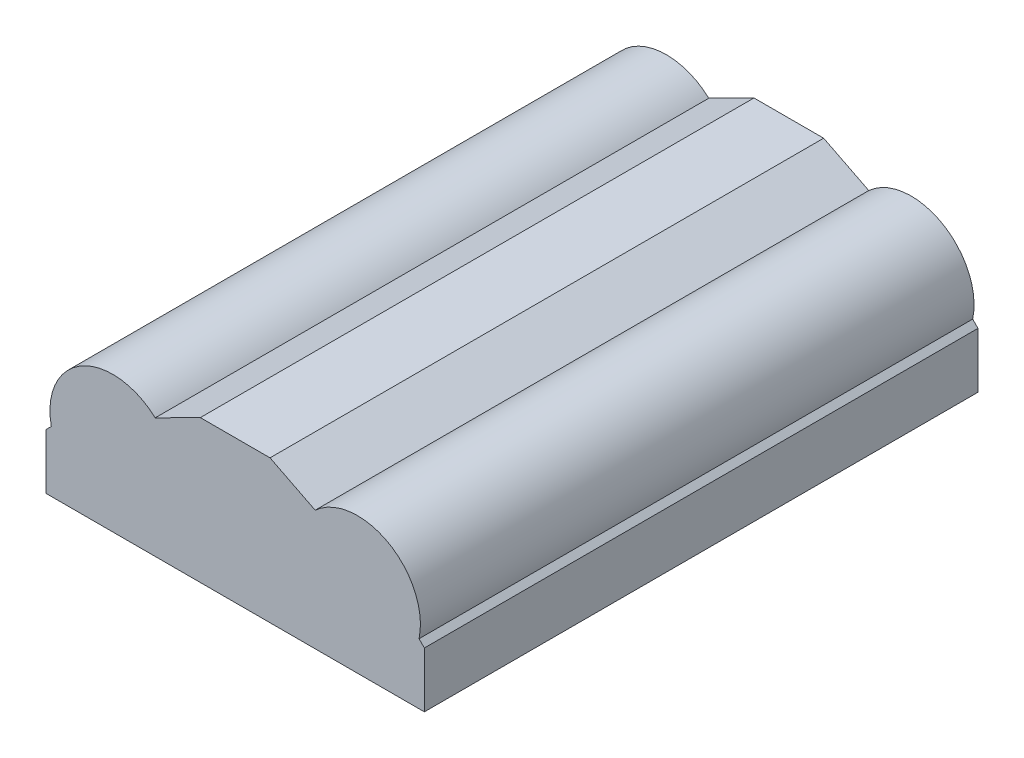
ISO-10303-21;
HEADER;
FILE_DESCRIPTION(('STEP AP214'),'2;1');
FILE_NAME('part.step','',(''),(''),'','','');
FILE_SCHEMA(('AUTOMOTIVE_DESIGN { 1 0 10303 214 1 1 1 1 }'));
ENDSEC;
DATA;
#1=APPLICATION_CONTEXT('core data for automotive mechanical design processes');
#2=APPLICATION_PROTOCOL_DEFINITION('international standard','automotive_design',2000,#1);
#3=PRODUCT_CONTEXT('',#1,'mechanical');
#4=PRODUCT('Part','Part','',(#3));
#5=PRODUCT_RELATED_PRODUCT_CATEGORY('part','',(#4));
#6=PRODUCT_DEFINITION_FORMATION('','',#4);
#7=PRODUCT_DEFINITION_CONTEXT('part definition',#1,'design');
#8=PRODUCT_DEFINITION('design','',#6,#7);
#9=PRODUCT_DEFINITION_SHAPE('','',#8);
#10=(LENGTH_UNIT() NAMED_UNIT(*) SI_UNIT(.MILLI.,.METRE.));
#11=(NAMED_UNIT(*) PLANE_ANGLE_UNIT() SI_UNIT($,.RADIAN.));
#12=(NAMED_UNIT(*) SI_UNIT($,.STERADIAN.) SOLID_ANGLE_UNIT());
#13=UNCERTAINTY_MEASURE_WITH_UNIT(LENGTH_MEASURE(1.E-05),#10,'distance_accuracy_value','');
#14=(GEOMETRIC_REPRESENTATION_CONTEXT(3) GLOBAL_UNCERTAINTY_ASSIGNED_CONTEXT((#13)) GLOBAL_UNIT_ASSIGNED_CONTEXT((#10,
#11,#12)) REPRESENTATION_CONTEXT('',''));
#15=CARTESIAN_POINT('',(0.,0.,0.));
#16=DIRECTION('',(0.,0.,1.));
#17=DIRECTION('',(1.,0.,0.));
#18=AXIS2_PLACEMENT_3D('',#15,#16,#17);
#19=CARTESIAN_POINT('',(0.,105.,0.));
#20=DIRECTION('',(1.,0.,0.));
#21=DIRECTION('',(0.,0.,-1.));
#22=AXIS2_PLACEMENT_3D('',#19,#20,#21);
#23=PLANE('',#22);
#24=DIRECTION('',(0.,0.,1.));
#25=VECTOR('',#24,1.);
#26=CARTESIAN_POINT('',(0.,27.7914883982121,-278.));
#27=LINE('',#26,#25);
#28=CARTESIAN_POINT('',(0.,27.7914883982121,-278.));
#29=VERTEX_POINT('',#28);
#30=CARTESIAN_POINT('',(0.,27.7914883982121,0.));
#31=VERTEX_POINT('',#30);
#32=EDGE_CURVE('E171',#29,#31,#27,.T.);
#33=ORIENTED_EDGE('',*,*,#32,.F.);
#34=DIRECTION('',(0.,-1.,0.));
#35=VECTOR('',#34,1.);
#36=CARTESIAN_POINT('',(0.,105.,-278.));
#37=LINE('',#36,#35);
#38=CARTESIAN_POINT('',(0.,0.,-278.));
#39=VERTEX_POINT('',#38);
#40=EDGE_CURVE('E60',#29,#39,#37,.T.);
#41=ORIENTED_EDGE('',*,*,#40,.T.);
#42=DIRECTION('',(0.,0.,1.));
#43=VECTOR('',#42,1.);
#44=CARTESIAN_POINT('',(0.,0.,0.));
#45=LINE('',#44,#43);
#46=CARTESIAN_POINT('',(0.,0.,0.));
#47=VERTEX_POINT('',#46);
#48=EDGE_CURVE('E173',#39,#47,#45,.T.);
#49=ORIENTED_EDGE('',*,*,#48,.T.);
#50=DIRECTION('',(0.,-1.,0.));
#51=VECTOR('',#50,1.);
#52=CARTESIAN_POINT('',(0.,105.,0.));
#53=LINE('',#52,#51);
#54=EDGE_CURVE('E12',#31,#47,#53,.T.);
#55=ORIENTED_EDGE('',*,*,#54,.F.);
#56=EDGE_LOOP('',(#33,#41,#49,#55));
#57=FACE_BOUND('',#56,.T.);
#58=ADVANCED_FACE('F38',(#57),#23,.F.);
#59=CARTESIAN_POINT('',(0.,105.,0.));
#60=DIRECTION('',(0.,0.,-1.));
#61=DIRECTION('',(-1.,0.,0.));
#62=AXIS2_PLACEMENT_3D('',#59,#60,#61);
#63=PLANE('',#62);
#64=DIRECTION('',(-0.707106781186542,-0.707106781186553,0.));
#65=VECTOR('',#64,1.);
#66=CARTESIAN_POINT('',(2.67483738491934,30.4663257831315,0.));
#67=LINE('',#66,#65);
#68=CARTESIAN_POINT('',(2.67483738491934,30.4663257831315,0.));
#69=VERTEX_POINT('',#68);
#70=EDGE_CURVE('E168',#69,#31,#67,.T.);
#71=ORIENTED_EDGE('',*,*,#70,.T.);
#72=ORIENTED_EDGE('',*,*,#54,.T.);
#73=DIRECTION('',(1.,0.,0.));
#74=VECTOR('',#73,1.);
#75=CARTESIAN_POINT('',(0.,0.,0.));
#76=LINE('',#75,#74);
#77=CARTESIAN_POINT('',(190.,0.,0.));
#78=VERTEX_POINT('',#77);
#79=EDGE_CURVE('E184',#47,#78,#76,.T.);
#80=ORIENTED_EDGE('',*,*,#79,.T.);
#81=DIRECTION('',(0.,-1.,0.));
#82=VECTOR('',#81,1.);
#83=CARTESIAN_POINT('',(190.,105.,0.));
#84=LINE('',#83,#82);
#85=CARTESIAN_POINT('',(190.,27.7914883982121,0.));
#86=VERTEX_POINT('',#85);
#87=EDGE_CURVE('E45',#86,#78,#84,.T.);
#88=ORIENTED_EDGE('',*,*,#87,.F.);
#89=DIRECTION('',(-0.707106781186541,0.707106781186554,0.));
#90=VECTOR('',#89,1.);
#91=CARTESIAN_POINT('',(187.325162615081,30.4663257831315,0.));
#92=LINE('',#91,#90);
#93=CARTESIAN_POINT('',(187.325162615081,30.4663257831315,0.));
#94=VERTEX_POINT('',#93);
#95=EDGE_CURVE('E153',#86,#94,#92,.T.);
#96=ORIENTED_EDGE('',*,*,#95,.T.);
#97=CARTESIAN_POINT('',(156.460287851345,37.0093674206708,0.));
#98=DIRECTION('',(0.,0.,1.));
#99=DIRECTION('',(-1.,0.,0.));
#100=AXIS2_PLACEMENT_3D('',#97,#98,#99);
#101=CIRCLE('',#100,31.5507826852471);
#102=CARTESIAN_POINT('',(135.163726992815,60.2882931615772,0.));
#103=VERTEX_POINT('',#102);
#104=EDGE_CURVE('E156',#94,#103,#101,.T.);
#105=ORIENTED_EDGE('',*,*,#104,.T.);
#106=DIRECTION('',(-0.892779007544047,0.450494887527778,0.));
#107=VECTOR('',#106,1.);
#108=CARTESIAN_POINT('',(135.163726992815,60.2882931615772,0.));
#109=LINE('',#108,#107);
#110=CARTESIAN_POINT('',(112.500479254422,71.7241324394375,0.));
#111=VERTEX_POINT('',#110);
#112=EDGE_CURVE('E123',#103,#111,#109,.T.);
#113=ORIENTED_EDGE('',*,*,#112,.T.);
#114=DIRECTION('',(-1.,0.,0.));
#115=VECTOR('',#114,1.);
#116=CARTESIAN_POINT('',(77.4995207455776,71.7241324394375,0.));
#117=LINE('',#116,#115);
#118=CARTESIAN_POINT('',(77.4995207455776,71.7241324394375,0.));
#119=VERTEX_POINT('',#118);
#120=EDGE_CURVE('E159',#111,#119,#117,.T.);
#121=ORIENTED_EDGE('',*,*,#120,.T.);
#122=DIRECTION('',(-0.892779007544047,-0.450494887527778,0.));
#123=VECTOR('',#122,1.);
#124=CARTESIAN_POINT('',(54.836273007185,60.2882931615772,0.));
#125=LINE('',#124,#123);
#126=CARTESIAN_POINT('',(54.836273007185,60.2882931615772,0.));
#127=VERTEX_POINT('',#126);
#128=EDGE_CURVE('E162',#119,#127,#125,.T.);
#129=ORIENTED_EDGE('',*,*,#128,.T.);
#130=CARTESIAN_POINT('',(33.5397121486554,37.0093674206708,0.));
#131=DIRECTION('',(0.,0.,1.));
#132=DIRECTION('',(1.,0.,0.));
#133=AXIS2_PLACEMENT_3D('',#130,#131,#132);
#134=CIRCLE('',#133,31.5507826852471);
#135=EDGE_CURVE('E165',#127,#69,#134,.T.);
#136=ORIENTED_EDGE('',*,*,#135,.T.);
#137=EDGE_LOOP('',(#71,#72,#80,#88,#96,#105,#113,#121,#129,#136));
#138=FACE_BOUND('',#137,.T.);
#139=ADVANCED_FACE('F202',(#138),#63,.F.);
#140=CARTESIAN_POINT('',(190.,105.,0.));
#141=DIRECTION('',(-1.,0.,0.));
#142=DIRECTION('',(0.,0.,1.));
#143=AXIS2_PLACEMENT_3D('',#140,#141,#142);
#144=PLANE('',#143);
#145=DIRECTION('',(0.,0.,1.));
#146=VECTOR('',#145,1.);
#147=CARTESIAN_POINT('',(190.,27.7914883982121,-278.));
#148=LINE('',#147,#146);
#149=CARTESIAN_POINT('',(190.,27.7914883982122,-278.));
#150=VERTEX_POINT('',#149);
#151=EDGE_CURVE('E52',#150,#86,#148,.T.);
#152=ORIENTED_EDGE('',*,*,#151,.T.);
#153=ORIENTED_EDGE('',*,*,#87,.T.);
#154=DIRECTION('',(0.,0.,-1.));
#155=VECTOR('',#154,1.);
#156=CARTESIAN_POINT('',(190.,0.,0.));
#157=LINE('',#156,#155);
#158=CARTESIAN_POINT('',(190.,0.,-278.));
#159=VERTEX_POINT('',#158);
#160=EDGE_CURVE('E187',#78,#159,#157,.T.);
#161=ORIENTED_EDGE('',*,*,#160,.T.);
#162=DIRECTION('',(0.,-1.,0.));
#163=VECTOR('',#162,1.);
#164=CARTESIAN_POINT('',(190.,105.,-278.));
#165=LINE('',#164,#163);
#166=EDGE_CURVE('E193',#150,#159,#165,.T.);
#167=ORIENTED_EDGE('',*,*,#166,.F.);
#168=EDGE_LOOP('',(#152,#153,#161,#167));
#169=FACE_BOUND('',#168,.T.);
#170=ADVANCED_FACE('F196',(#169),#144,.F.);
#171=CARTESIAN_POINT('',(0.,105.,-278.));
#172=DIRECTION('',(0.,0.,1.));
#173=DIRECTION('',(1.,0.,0.));
#174=AXIS2_PLACEMENT_3D('',#171,#172,#173);
#175=PLANE('',#174);
#176=DIRECTION('',(-0.707106781186542,-0.707106781186553,0.));
#177=VECTOR('',#176,1.);
#178=CARTESIAN_POINT('',(2.67483738491934,30.4663257831315,-278.));
#179=LINE('',#178,#177);
#180=CARTESIAN_POINT('',(2.67483738491934,30.4663257831315,-278.));
#181=VERTEX_POINT('',#180);
#182=EDGE_CURVE('E151',#181,#29,#179,.T.);
#183=ORIENTED_EDGE('',*,*,#182,.F.);
#184=CARTESIAN_POINT('',(33.5397121486554,37.0093674206708,-278.));
#185=DIRECTION('',(0.,0.,1.));
#186=DIRECTION('',(1.,0.,0.));
#187=AXIS2_PLACEMENT_3D('',#184,#185,#186);
#188=CIRCLE('',#187,31.5507826852471);
#189=CARTESIAN_POINT('',(54.836273007185,60.2882931615772,-278.));
#190=VERTEX_POINT('',#189);
#191=EDGE_CURVE('E148',#190,#181,#188,.T.);
#192=ORIENTED_EDGE('',*,*,#191,.F.);
#193=DIRECTION('',(-0.892779007544047,-0.450494887527778,0.));
#194=VECTOR('',#193,1.);
#195=CARTESIAN_POINT('',(54.836273007185,60.2882931615772,-278.));
#196=LINE('',#195,#194);
#197=CARTESIAN_POINT('',(77.4995207455776,71.7241324394375,-278.));
#198=VERTEX_POINT('',#197);
#199=EDGE_CURVE('E142',#198,#190,#196,.T.);
#200=ORIENTED_EDGE('',*,*,#199,.F.);
#201=DIRECTION('',(-1.,0.,0.));
#202=VECTOR('',#201,1.);
#203=CARTESIAN_POINT('',(77.4995207455776,71.7241324394375,-278.));
#204=LINE('',#203,#202);
#205=CARTESIAN_POINT('',(112.500479254422,71.7241324394375,-278.));
#206=VERTEX_POINT('',#205);
#207=EDGE_CURVE('E140',#206,#198,#204,.T.);
#208=ORIENTED_EDGE('',*,*,#207,.F.);
#209=DIRECTION('',(-0.892779007544047,0.450494887527778,0.));
#210=VECTOR('',#209,1.);
#211=CARTESIAN_POINT('',(135.163726992815,60.2882931615772,-278.));
#212=LINE('',#211,#210);
#213=CARTESIAN_POINT('',(135.163726992815,60.2882931615772,-278.));
#214=VERTEX_POINT('',#213);
#215=EDGE_CURVE('E120',#214,#206,#212,.T.);
#216=ORIENTED_EDGE('',*,*,#215,.F.);
#217=CARTESIAN_POINT('',(156.460287851345,37.0093674206708,-278.));
#218=DIRECTION('',(0.,0.,1.));
#219=DIRECTION('',(-1.,0.,0.));
#220=AXIS2_PLACEMENT_3D('',#217,#218,#219);
#221=CIRCLE('',#220,31.5507826852471);
#222=CARTESIAN_POINT('',(187.325162615081,30.4663257831315,-278.));
#223=VERTEX_POINT('',#222);
#224=EDGE_CURVE('E131',#223,#214,#221,.T.);
#225=ORIENTED_EDGE('',*,*,#224,.F.);
#226=DIRECTION('',(-0.707106781186541,0.707106781186554,0.));
#227=VECTOR('',#226,1.);
#228=CARTESIAN_POINT('',(187.325162615081,30.4663257831315,-278.));
#229=LINE('',#228,#227);
#230=EDGE_CURVE('E134',#150,#223,#229,.T.);
#231=ORIENTED_EDGE('',*,*,#230,.F.);
#232=ORIENTED_EDGE('',*,*,#166,.T.);
#233=DIRECTION('',(-1.,0.,0.));
#234=VECTOR('',#233,1.);
#235=CARTESIAN_POINT('',(0.,0.,-278.));
#236=LINE('',#235,#234);
#237=EDGE_CURVE('E190',#159,#39,#236,.T.);
#238=ORIENTED_EDGE('',*,*,#237,.T.);
#239=ORIENTED_EDGE('',*,*,#40,.F.);
#240=EDGE_LOOP('',(#183,#192,#200,#208,#216,#225,#231,#232,#238,#239));
#241=FACE_BOUND('',#240,.T.);
#242=ADVANCED_FACE('F137',(#241),#175,.F.);
#243=CARTESIAN_POINT('',(0.,0.,0.));
#244=DIRECTION('',(0.,-1.,0.));
#245=DIRECTION('',(0.,0.,-1.));
#246=AXIS2_PLACEMENT_3D('',#243,#244,#245);
#247=PLANE('',#246);
#248=ORIENTED_EDGE('',*,*,#48,.F.);
#249=ORIENTED_EDGE('',*,*,#237,.F.);
#250=ORIENTED_EDGE('',*,*,#160,.F.);
#251=ORIENTED_EDGE('',*,*,#79,.F.);
#252=EDGE_LOOP('',(#248,#249,#250,#251));
#253=FACE_BOUND('',#252,.T.);
#254=ADVANCED_FACE('F206',(#253),#247,.T.);
#255=CARTESIAN_POINT('',(2.67483738491934,30.4663257831315,-278.));
#256=DIRECTION('',(-0.707106781186553,0.707106781186542,0.));
#257=DIRECTION('',(-0.707106781186542,-0.707106781186553,0.));
#258=AXIS2_PLACEMENT_3D('',#255,#256,#257);
#259=PLANE('',#258);
#260=ORIENTED_EDGE('',*,*,#70,.F.);
#261=DIRECTION('',(0.,0.,1.));
#262=VECTOR('',#261,1.);
#263=CARTESIAN_POINT('',(2.67483738491934,30.4663257831315,-278.));
#264=LINE('',#263,#262);
#265=EDGE_CURVE('E174',#181,#69,#264,.T.);
#266=ORIENTED_EDGE('',*,*,#265,.F.);
#267=ORIENTED_EDGE('',*,*,#182,.T.);
#268=ORIENTED_EDGE('',*,*,#32,.T.);
#269=EDGE_LOOP('',(#260,#266,#267,#268));
#270=FACE_BOUND('',#269,.T.);
#271=ADVANCED_FACE('F220',(#270),#259,.T.);
#272=CARTESIAN_POINT('',(33.5397121486554,37.0093674206708,-278.));
#273=DIRECTION('',(0.,0.,1.));
#274=DIRECTION('',(1.,0.,0.));
#275=AXIS2_PLACEMENT_3D('',#272,#273,#274);
#276=CYLINDRICAL_SURFACE('',#275,31.5507826852471);
#277=ORIENTED_EDGE('',*,*,#135,.F.);
#278=DIRECTION('',(0.,0.,1.));
#279=VECTOR('',#278,1.);
#280=CARTESIAN_POINT('',(54.836273007185,60.2882931615772,-278.));
#281=LINE('',#280,#279);
#282=EDGE_CURVE('E176',#190,#127,#281,.T.);
#283=ORIENTED_EDGE('',*,*,#282,.F.);
#284=ORIENTED_EDGE('',*,*,#191,.T.);
#285=ORIENTED_EDGE('',*,*,#265,.T.);
#286=EDGE_LOOP('',(#277,#283,#284,#285));
#287=FACE_BOUND('',#286,.T.);
#288=ADVANCED_FACE('F217',(#287),#276,.T.);
#289=CARTESIAN_POINT('',(54.836273007185,60.2882931615772,-278.));
#290=DIRECTION('',(-0.450494887527778,0.892779007544048,0.));
#291=DIRECTION('',(-0.892779007544048,-0.450494887527778,0.));
#292=AXIS2_PLACEMENT_3D('',#289,#290,#291);
#293=PLANE('',#292);
#294=ORIENTED_EDGE('',*,*,#128,.F.);
#295=DIRECTION('',(0.,0.,1.));
#296=VECTOR('',#295,1.);
#297=CARTESIAN_POINT('',(77.4995207455776,71.7241324394375,-278.));
#298=LINE('',#297,#296);
#299=EDGE_CURVE('E178',#198,#119,#298,.T.);
#300=ORIENTED_EDGE('',*,*,#299,.F.);
#301=ORIENTED_EDGE('',*,*,#199,.T.);
#302=ORIENTED_EDGE('',*,*,#282,.T.);
#303=EDGE_LOOP('',(#294,#300,#301,#302));
#304=FACE_BOUND('',#303,.T.);
#305=ADVANCED_FACE('F213',(#304),#293,.T.);
#306=CARTESIAN_POINT('',(77.4995207455776,71.7241324394375,-278.));
#307=DIRECTION('',(0.,1.,0.));
#308=DIRECTION('',(0.,0.,1.));
#309=AXIS2_PLACEMENT_3D('',#306,#307,#308);
#310=PLANE('',#309);
#311=ORIENTED_EDGE('',*,*,#120,.F.);
#312=DIRECTION('',(0.,0.,1.));
#313=VECTOR('',#312,1.);
#314=CARTESIAN_POINT('',(112.500479254422,71.7241324394375,-278.));
#315=LINE('',#314,#313);
#316=EDGE_CURVE('E127',#206,#111,#315,.T.);
#317=ORIENTED_EDGE('',*,*,#316,.F.);
#318=ORIENTED_EDGE('',*,*,#207,.T.);
#319=ORIENTED_EDGE('',*,*,#299,.T.);
#320=EDGE_LOOP('',(#311,#317,#318,#319));
#321=FACE_BOUND('',#320,.T.);
#322=ADVANCED_FACE('F211',(#321),#310,.T.);
#323=CARTESIAN_POINT('',(135.163726992815,60.2882931615772,-278.));
#324=DIRECTION('',(0.450494887527778,0.892779007544048,0.));
#325=DIRECTION('',(-0.892779007544048,0.450494887527778,0.));
#326=AXIS2_PLACEMENT_3D('',#323,#324,#325);
#327=PLANE('',#326);
#328=ORIENTED_EDGE('',*,*,#112,.F.);
#329=DIRECTION('',(0.,0.,1.));
#330=VECTOR('',#329,1.);
#331=CARTESIAN_POINT('',(135.163726992815,60.2882931615772,-278.));
#332=LINE('',#331,#330);
#333=EDGE_CURVE('E116',#214,#103,#332,.T.);
#334=ORIENTED_EDGE('',*,*,#333,.F.);
#335=ORIENTED_EDGE('',*,*,#215,.T.);
#336=ORIENTED_EDGE('',*,*,#316,.T.);
#337=EDGE_LOOP('',(#328,#334,#335,#336));
#338=FACE_BOUND('',#337,.T.);
#339=ADVANCED_FACE('F118',(#338),#327,.T.);
#340=CARTESIAN_POINT('',(156.460287851345,37.0093674206708,-278.));
#341=DIRECTION('',(0.,0.,1.));
#342=DIRECTION('',(1.,0.,0.));
#343=AXIS2_PLACEMENT_3D('',#340,#341,#342);
#344=CYLINDRICAL_SURFACE('',#343,31.5507826852471);
#345=ORIENTED_EDGE('',*,*,#104,.F.);
#346=DIRECTION('',(0.,0.,1.));
#347=VECTOR('',#346,1.);
#348=CARTESIAN_POINT('',(187.325162615081,30.4663257831315,-278.));
#349=LINE('',#348,#347);
#350=EDGE_CURVE('E128',#223,#94,#349,.T.);
#351=ORIENTED_EDGE('',*,*,#350,.F.);
#352=ORIENTED_EDGE('',*,*,#224,.T.);
#353=ORIENTED_EDGE('',*,*,#333,.T.);
#354=EDGE_LOOP('',(#345,#351,#352,#353));
#355=FACE_BOUND('',#354,.T.);
#356=ADVANCED_FACE('F132',(#355),#344,.T.);
#357=CARTESIAN_POINT('',(187.325162615081,30.4663257831315,-278.));
#358=DIRECTION('',(0.707106781186554,0.707106781186541,0.));
#359=DIRECTION('',(-0.707106781186541,0.707106781186554,0.));
#360=AXIS2_PLACEMENT_3D('',#357,#358,#359);
#361=PLANE('',#360);
#362=ORIENTED_EDGE('',*,*,#95,.F.);
#363=ORIENTED_EDGE('',*,*,#151,.F.);
#364=ORIENTED_EDGE('',*,*,#230,.T.);
#365=ORIENTED_EDGE('',*,*,#350,.T.);
#366=EDGE_LOOP('',(#362,#363,#364,#365));
#367=FACE_BOUND('',#366,.T.);
#368=ADVANCED_FACE('F207',(#367),#361,.T.);
#369=CLOSED_SHELL('',(#58,#139,#170,#242,#254,#271,#288,#305,#322,#339,#356,#368));
#370=MANIFOLD_SOLID_BREP('B2',#369);
#371=ADVANCED_BREP_SHAPE_REPRESENTATION('',(#18,#370),#14);
#372=SHAPE_DEFINITION_REPRESENTATION(#9,#371);
ENDSEC;
END-ISO-10303-21;
